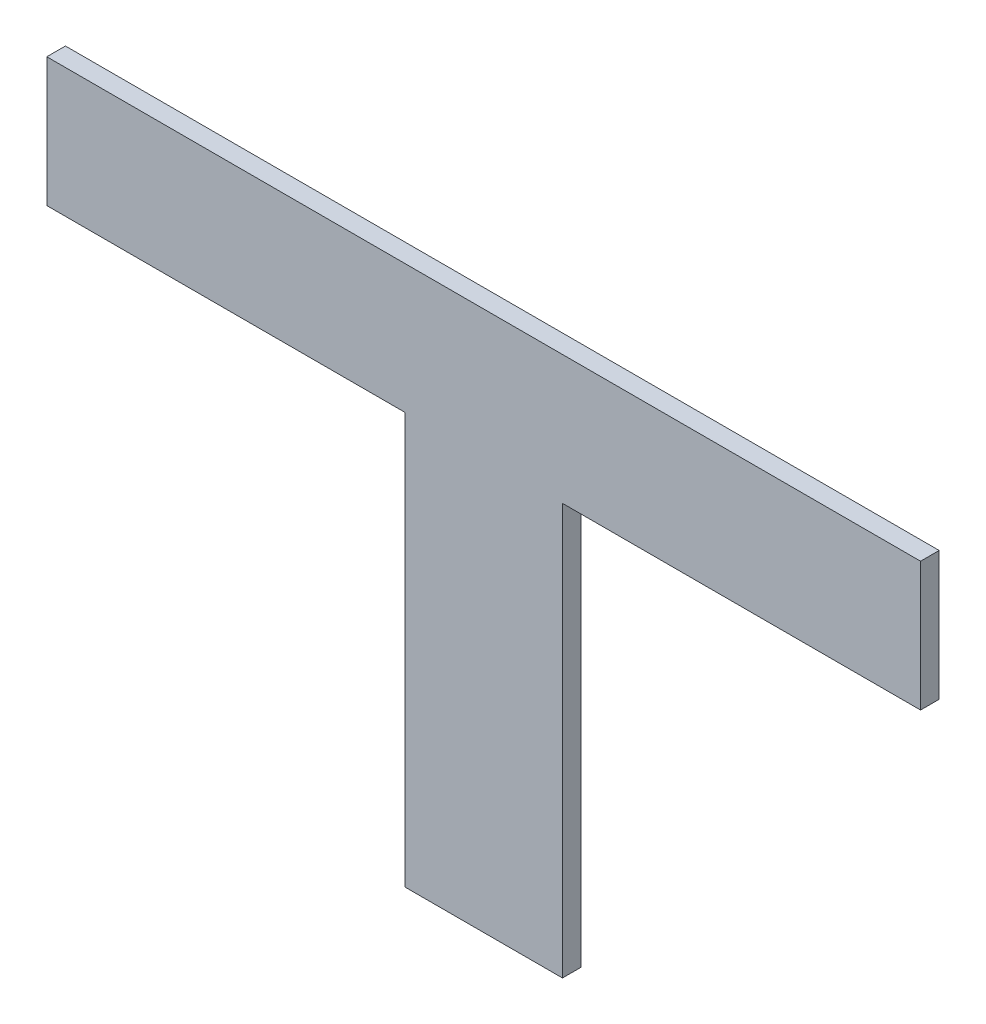
ISO-10303-21;
HEADER;
FILE_DESCRIPTION(('STEP AP214'),'2;1');
FILE_NAME('part.step','',(''),(''),'','','');
FILE_SCHEMA(('AUTOMOTIVE_DESIGN { 1 0 10303 214 1 1 1 1 }'));
ENDSEC;
DATA;
#1=APPLICATION_CONTEXT('core data for automotive mechanical design processes');
#2=APPLICATION_PROTOCOL_DEFINITION('international standard','automotive_design',2000,#1);
#3=PRODUCT_CONTEXT('',#1,'mechanical');
#4=PRODUCT('Part','Part','',(#3));
#5=PRODUCT_RELATED_PRODUCT_CATEGORY('part','',(#4));
#6=PRODUCT_DEFINITION_FORMATION('','',#4);
#7=PRODUCT_DEFINITION_CONTEXT('part definition',#1,'design');
#8=PRODUCT_DEFINITION('design','',#6,#7);
#9=PRODUCT_DEFINITION_SHAPE('','',#8);
#10=(LENGTH_UNIT() NAMED_UNIT(*) SI_UNIT(.MILLI.,.METRE.));
#11=(NAMED_UNIT(*) PLANE_ANGLE_UNIT() SI_UNIT($,.RADIAN.));
#12=(NAMED_UNIT(*) SI_UNIT($,.STERADIAN.) SOLID_ANGLE_UNIT());
#13=UNCERTAINTY_MEASURE_WITH_UNIT(LENGTH_MEASURE(1.E-05),#10,'distance_accuracy_value','');
#14=(GEOMETRIC_REPRESENTATION_CONTEXT(3) GLOBAL_UNCERTAINTY_ASSIGNED_CONTEXT((#13)) GLOBAL_UNIT_ASSIGNED_CONTEXT((#10,
#11,#12)) REPRESENTATION_CONTEXT('',''));
#15=CARTESIAN_POINT('',(0.,0.,0.));
#16=DIRECTION('',(0.,0.,1.));
#17=DIRECTION('',(1.,0.,0.));
#18=AXIS2_PLACEMENT_3D('',#15,#16,#17);
#19=CARTESIAN_POINT('',(2.11538461538463,-15.,0.5));
#20=DIRECTION('',(-1.,0.,0.));
#21=DIRECTION('',(0.,0.,1.));
#22=AXIS2_PLACEMENT_3D('',#19,#20,#21);
#23=PLANE('',#22);
#24=DIRECTION('',(0.,1.,0.));
#25=VECTOR('',#24,1.);
#26=CARTESIAN_POINT('',(2.11538461538463,-15.,0.5));
#27=LINE('',#26,#25);
#28=CARTESIAN_POINT('',(2.11538461538463,0.499999999999997,0.5));
#29=VERTEX_POINT('',#28);
#30=CARTESIAN_POINT('',(2.11538461538463,11.5384615384615,0.5));
#31=VERTEX_POINT('',#30);
#32=EDGE_CURVE('E120',#29,#31,#27,.T.);
#33=ORIENTED_EDGE('',*,*,#32,.F.);
#34=DIRECTION('',(0.,0.,-1.));
#35=VECTOR('',#34,1.);
#36=CARTESIAN_POINT('',(2.11538461538463,0.5,0.5));
#37=LINE('',#36,#35);
#38=CARTESIAN_POINT('',(2.11538461538463,0.499999999999999,0.));
#39=VERTEX_POINT('',#38);
#40=EDGE_CURVE('E53',#29,#39,#37,.T.);
#41=ORIENTED_EDGE('',*,*,#40,.T.);
#42=DIRECTION('',(0.,1.,0.));
#43=VECTOR('',#42,1.);
#44=CARTESIAN_POINT('',(2.11538461538463,-15.,0.));
#45=LINE('',#44,#43);
#46=CARTESIAN_POINT('',(2.11538461538463,11.5384615384615,0.));
#47=VERTEX_POINT('',#46);
#48=EDGE_CURVE('E115',#39,#47,#45,.T.);
#49=ORIENTED_EDGE('',*,*,#48,.T.);
#50=DIRECTION('',(0.,0.,-1.));
#51=VECTOR('',#50,1.);
#52=CARTESIAN_POINT('',(2.11538461538463,11.5384615384615,0.5));
#53=LINE('',#52,#51);
#54=EDGE_CURVE('E140',#31,#47,#53,.T.);
#55=ORIENTED_EDGE('',*,*,#54,.F.);
#56=EDGE_LOOP('',(#33,#41,#49,#55));
#57=FACE_BOUND('',#56,.T.);
#58=ADVANCED_FACE('F39',(#57),#23,.F.);
#59=CARTESIAN_POINT('',(-2.1153846153846,11.5384615384615,0.5));
#60=DIRECTION('',(1.,0.,0.));
#61=DIRECTION('',(0.,0.,-1.));
#62=AXIS2_PLACEMENT_3D('',#59,#60,#61);
#63=PLANE('',#62);
#64=DIRECTION('',(0.,-1.,0.));
#65=VECTOR('',#64,1.);
#66=CARTESIAN_POINT('',(-2.1153846153846,11.5384615384615,0.));
#67=LINE('',#66,#65);
#68=CARTESIAN_POINT('',(-2.1153846153846,11.5384615384615,0.));
#69=VERTEX_POINT('',#68);
#70=CARTESIAN_POINT('',(-2.1153846153846,0.500000000000001,0.));
#71=VERTEX_POINT('',#70);
#72=EDGE_CURVE('E103',#69,#71,#67,.T.);
#73=ORIENTED_EDGE('',*,*,#72,.T.);
#74=DIRECTION('',(0.,0.,1.));
#75=VECTOR('',#74,1.);
#76=CARTESIAN_POINT('',(-2.1153846153846,0.5,0.5));
#77=LINE('',#76,#75);
#78=CARTESIAN_POINT('',(-2.1153846153846,0.5,0.5));
#79=VERTEX_POINT('',#78);
#80=EDGE_CURVE('E100',#71,#79,#77,.T.);
#81=ORIENTED_EDGE('',*,*,#80,.T.);
#82=DIRECTION('',(0.,-1.,0.));
#83=VECTOR('',#82,1.);
#84=CARTESIAN_POINT('',(-2.1153846153846,11.5384615384615,0.5));
#85=LINE('',#84,#83);
#86=CARTESIAN_POINT('',(-2.1153846153846,11.5384615384615,0.5));
#87=VERTEX_POINT('',#86);
#88=EDGE_CURVE('E123',#87,#79,#85,.T.);
#89=ORIENTED_EDGE('',*,*,#88,.F.);
#90=DIRECTION('',(0.,0.,-1.));
#91=VECTOR('',#90,1.);
#92=CARTESIAN_POINT('',(-2.1153846153846,11.5384615384615,0.5));
#93=LINE('',#92,#91);
#94=EDGE_CURVE('E101',#87,#69,#93,.T.);
#95=ORIENTED_EDGE('',*,*,#94,.T.);
#96=EDGE_LOOP('',(#73,#81,#89,#95));
#97=FACE_BOUND('',#96,.T.);
#98=ADVANCED_FACE('F114',(#97),#63,.F.);
#99=CARTESIAN_POINT('',(0.,0.,0.5));
#100=DIRECTION('',(0.,0.,1.));
#101=DIRECTION('',(1.,0.,0.));
#102=AXIS2_PLACEMENT_3D('',#99,#100,#101);
#103=PLANE('',#102);
#104=DIRECTION('',(-1.,0.,0.));
#105=VECTOR('',#104,1.);
#106=CARTESIAN_POINT('',(0.,0.5,0.5));
#107=LINE('',#106,#105);
#108=EDGE_CURVE('E48',#29,#79,#107,.T.);
#109=ORIENTED_EDGE('',*,*,#108,.F.);
#110=ORIENTED_EDGE('',*,*,#32,.T.);
#111=DIRECTION('',(1.,0.,0.));
#112=VECTOR('',#111,1.);
#113=CARTESIAN_POINT('',(2.11538461538463,11.5384615384615,0.5));
#114=LINE('',#113,#112);
#115=CARTESIAN_POINT('',(11.7307692307692,11.5384615384615,0.5));
#116=VERTEX_POINT('',#115);
#117=EDGE_CURVE('E118',#31,#116,#114,.T.);
#118=ORIENTED_EDGE('',*,*,#117,.T.);
#119=DIRECTION('',(0.,1.,0.));
#120=VECTOR('',#119,1.);
#121=CARTESIAN_POINT('',(11.7307692307692,11.5384615384615,0.5));
#122=LINE('',#121,#120);
#123=CARTESIAN_POINT('',(11.7307692307692,15.,0.5));
#124=VERTEX_POINT('',#123);
#125=EDGE_CURVE('E129',#116,#124,#122,.T.);
#126=ORIENTED_EDGE('',*,*,#125,.T.);
#127=DIRECTION('',(-1.,0.,0.));
#128=VECTOR('',#127,1.);
#129=CARTESIAN_POINT('',(11.7307692307692,15.,0.5));
#130=LINE('',#129,#128);
#131=CARTESIAN_POINT('',(-11.7307692307692,15.,0.5));
#132=VERTEX_POINT('',#131);
#133=EDGE_CURVE('E131',#124,#132,#130,.T.);
#134=ORIENTED_EDGE('',*,*,#133,.T.);
#135=DIRECTION('',(0.,-1.,0.));
#136=VECTOR('',#135,1.);
#137=CARTESIAN_POINT('',(-11.7307692307692,15.,0.5));
#138=LINE('',#137,#136);
#139=CARTESIAN_POINT('',(-11.7307692307692,11.5384615384615,0.5));
#140=VERTEX_POINT('',#139);
#141=EDGE_CURVE('E133',#132,#140,#138,.T.);
#142=ORIENTED_EDGE('',*,*,#141,.T.);
#143=DIRECTION('',(1.,0.,0.));
#144=VECTOR('',#143,1.);
#145=CARTESIAN_POINT('',(-11.7307692307692,11.5384615384615,0.5));
#146=LINE('',#145,#144);
#147=EDGE_CURVE('E125',#140,#87,#146,.T.);
#148=ORIENTED_EDGE('',*,*,#147,.T.);
#149=ORIENTED_EDGE('',*,*,#88,.T.);
#150=EDGE_LOOP('',(#109,#110,#118,#126,#134,#142,#148,#149));
#151=FACE_BOUND('',#150,.T.);
#152=ADVANCED_FACE('F177',(#151),#103,.T.);
#153=CARTESIAN_POINT('',(0.,0.,0.));
#154=DIRECTION('',(0.,0.,1.));
#155=DIRECTION('',(1.,0.,0.));
#156=AXIS2_PLACEMENT_3D('',#153,#154,#155);
#157=PLANE('',#156);
#158=DIRECTION('',(1.,0.,0.));
#159=VECTOR('',#158,1.);
#160=CARTESIAN_POINT('',(-17.,0.5,0.));
#161=LINE('',#160,#159);
#162=EDGE_CURVE('E11',#71,#39,#161,.T.);
#163=ORIENTED_EDGE('',*,*,#162,.F.);
#164=ORIENTED_EDGE('',*,*,#72,.F.);
#165=DIRECTION('',(1.,0.,0.));
#166=VECTOR('',#165,1.);
#167=CARTESIAN_POINT('',(-11.7307692307692,11.5384615384615,0.));
#168=LINE('',#167,#166);
#169=CARTESIAN_POINT('',(-11.7307692307692,11.5384615384615,0.));
#170=VERTEX_POINT('',#169);
#171=EDGE_CURVE('E150',#170,#69,#168,.T.);
#172=ORIENTED_EDGE('',*,*,#171,.F.);
#173=DIRECTION('',(0.,-1.,0.));
#174=VECTOR('',#173,1.);
#175=CARTESIAN_POINT('',(-11.7307692307692,15.,0.));
#176=LINE('',#175,#174);
#177=CARTESIAN_POINT('',(-11.7307692307692,15.,0.));
#178=VERTEX_POINT('',#177);
#179=EDGE_CURVE('E143',#178,#170,#176,.T.);
#180=ORIENTED_EDGE('',*,*,#179,.F.);
#181=DIRECTION('',(-1.,0.,0.));
#182=VECTOR('',#181,1.);
#183=CARTESIAN_POINT('',(11.7307692307692,15.,0.));
#184=LINE('',#183,#182);
#185=CARTESIAN_POINT('',(11.7307692307692,15.,0.));
#186=VERTEX_POINT('',#185);
#187=EDGE_CURVE('E141',#186,#178,#184,.T.);
#188=ORIENTED_EDGE('',*,*,#187,.F.);
#189=DIRECTION('',(0.,1.,0.));
#190=VECTOR('',#189,1.);
#191=CARTESIAN_POINT('',(11.7307692307692,11.5384615384615,0.));
#192=LINE('',#191,#190);
#193=CARTESIAN_POINT('',(11.7307692307692,11.5384615384615,0.));
#194=VERTEX_POINT('',#193);
#195=EDGE_CURVE('E138',#194,#186,#192,.T.);
#196=ORIENTED_EDGE('',*,*,#195,.F.);
#197=DIRECTION('',(1.,0.,0.));
#198=VECTOR('',#197,1.);
#199=CARTESIAN_POINT('',(2.11538461538463,11.5384615384615,0.));
#200=LINE('',#199,#198);
#201=EDGE_CURVE('E121',#47,#194,#200,.T.);
#202=ORIENTED_EDGE('',*,*,#201,.F.);
#203=ORIENTED_EDGE('',*,*,#48,.F.);
#204=EDGE_LOOP('',(#163,#164,#172,#180,#188,#196,#202,#203));
#205=FACE_BOUND('',#204,.T.);
#206=ADVANCED_FACE('F41',(#205),#157,.F.);
#207=CARTESIAN_POINT('',(2.11538461538463,11.5384615384615,0.5));
#208=DIRECTION('',(0.,1.,0.));
#209=DIRECTION('',(0.,0.,1.));
#210=AXIS2_PLACEMENT_3D('',#207,#208,#209);
#211=PLANE('',#210);
#212=ORIENTED_EDGE('',*,*,#201,.T.);
#213=DIRECTION('',(0.,0.,-1.));
#214=VECTOR('',#213,1.);
#215=CARTESIAN_POINT('',(11.7307692307692,11.5384615384615,0.5));
#216=LINE('',#215,#214);
#217=EDGE_CURVE('E139',#116,#194,#216,.T.);
#218=ORIENTED_EDGE('',*,*,#217,.F.);
#219=ORIENTED_EDGE('',*,*,#117,.F.);
#220=ORIENTED_EDGE('',*,*,#54,.T.);
#221=EDGE_LOOP('',(#212,#218,#219,#220));
#222=FACE_BOUND('',#221,.T.);
#223=ADVANCED_FACE('F164',(#222),#211,.F.);
#224=CARTESIAN_POINT('',(11.7307692307692,11.5384615384615,0.5));
#225=DIRECTION('',(-1.,0.,0.));
#226=DIRECTION('',(0.,0.,1.));
#227=AXIS2_PLACEMENT_3D('',#224,#225,#226);
#228=PLANE('',#227);
#229=ORIENTED_EDGE('',*,*,#195,.T.);
#230=DIRECTION('',(0.,0.,-1.));
#231=VECTOR('',#230,1.);
#232=CARTESIAN_POINT('',(11.7307692307692,15.,0.5));
#233=LINE('',#232,#231);
#234=EDGE_CURVE('E142',#124,#186,#233,.T.);
#235=ORIENTED_EDGE('',*,*,#234,.F.);
#236=ORIENTED_EDGE('',*,*,#125,.F.);
#237=ORIENTED_EDGE('',*,*,#217,.T.);
#238=EDGE_LOOP('',(#229,#235,#236,#237));
#239=FACE_BOUND('',#238,.T.);
#240=ADVANCED_FACE('F173',(#239),#228,.F.);
#241=CARTESIAN_POINT('',(11.7307692307692,15.,0.5));
#242=DIRECTION('',(0.,-1.,0.));
#243=DIRECTION('',(0.,0.,-1.));
#244=AXIS2_PLACEMENT_3D('',#241,#242,#243);
#245=PLANE('',#244);
#246=ORIENTED_EDGE('',*,*,#187,.T.);
#247=DIRECTION('',(0.,0.,-1.));
#248=VECTOR('',#247,1.);
#249=CARTESIAN_POINT('',(-11.7307692307692,15.,0.5));
#250=LINE('',#249,#248);
#251=EDGE_CURVE('E147',#132,#178,#250,.T.);
#252=ORIENTED_EDGE('',*,*,#251,.F.);
#253=ORIENTED_EDGE('',*,*,#133,.F.);
#254=ORIENTED_EDGE('',*,*,#234,.T.);
#255=EDGE_LOOP('',(#246,#252,#253,#254));
#256=FACE_BOUND('',#255,.T.);
#257=ADVANCED_FACE('F172',(#256),#245,.F.);
#258=CARTESIAN_POINT('',(-11.7307692307692,15.,0.5));
#259=DIRECTION('',(1.,0.,0.));
#260=DIRECTION('',(0.,0.,-1.));
#261=AXIS2_PLACEMENT_3D('',#258,#259,#260);
#262=PLANE('',#261);
#263=ORIENTED_EDGE('',*,*,#179,.T.);
#264=DIRECTION('',(0.,0.,-1.));
#265=VECTOR('',#264,1.);
#266=CARTESIAN_POINT('',(-11.7307692307692,11.5384615384615,0.5));
#267=LINE('',#266,#265);
#268=EDGE_CURVE('E124',#140,#170,#267,.T.);
#269=ORIENTED_EDGE('',*,*,#268,.F.);
#270=ORIENTED_EDGE('',*,*,#141,.F.);
#271=ORIENTED_EDGE('',*,*,#251,.T.);
#272=EDGE_LOOP('',(#263,#269,#270,#271));
#273=FACE_BOUND('',#272,.T.);
#274=ADVANCED_FACE('F193',(#273),#262,.F.);
#275=CARTESIAN_POINT('',(-11.7307692307692,11.5384615384615,0.5));
#276=DIRECTION('',(0.,1.,0.));
#277=DIRECTION('',(0.,0.,1.));
#278=AXIS2_PLACEMENT_3D('',#275,#276,#277);
#279=PLANE('',#278);
#280=ORIENTED_EDGE('',*,*,#171,.T.);
#281=ORIENTED_EDGE('',*,*,#94,.F.);
#282=ORIENTED_EDGE('',*,*,#147,.F.);
#283=ORIENTED_EDGE('',*,*,#268,.T.);
#284=EDGE_LOOP('',(#280,#281,#282,#283));
#285=FACE_BOUND('',#284,.T.);
#286=ADVANCED_FACE('F195',(#285),#279,.F.);
#287=CARTESIAN_POINT('',(-17.,0.5,1.));
#288=DIRECTION('',(0.,1.,0.));
#289=DIRECTION('',(0.,0.,1.));
#290=AXIS2_PLACEMENT_3D('',#287,#288,#289);
#291=PLANE('',#290);
#292=ORIENTED_EDGE('',*,*,#108,.T.);
#293=ORIENTED_EDGE('',*,*,#80,.F.);
#294=ORIENTED_EDGE('',*,*,#162,.T.);
#295=ORIENTED_EDGE('',*,*,#40,.F.);
#296=EDGE_LOOP('',(#292,#293,#294,#295));
#297=FACE_BOUND('',#296,.T.);
#298=ADVANCED_FACE('F98',(#297),#291,.F.);
#299=CLOSED_SHELL('',(#58,#98,#152,#206,#223,#240,#257,#274,#286,#298));
#300=MANIFOLD_SOLID_BREP('B2',#299);
#301=ADVANCED_BREP_SHAPE_REPRESENTATION('',(#18,#300),#14);
#302=SHAPE_DEFINITION_REPRESENTATION(#9,#301);
ENDSEC;
END-ISO-10303-21;
